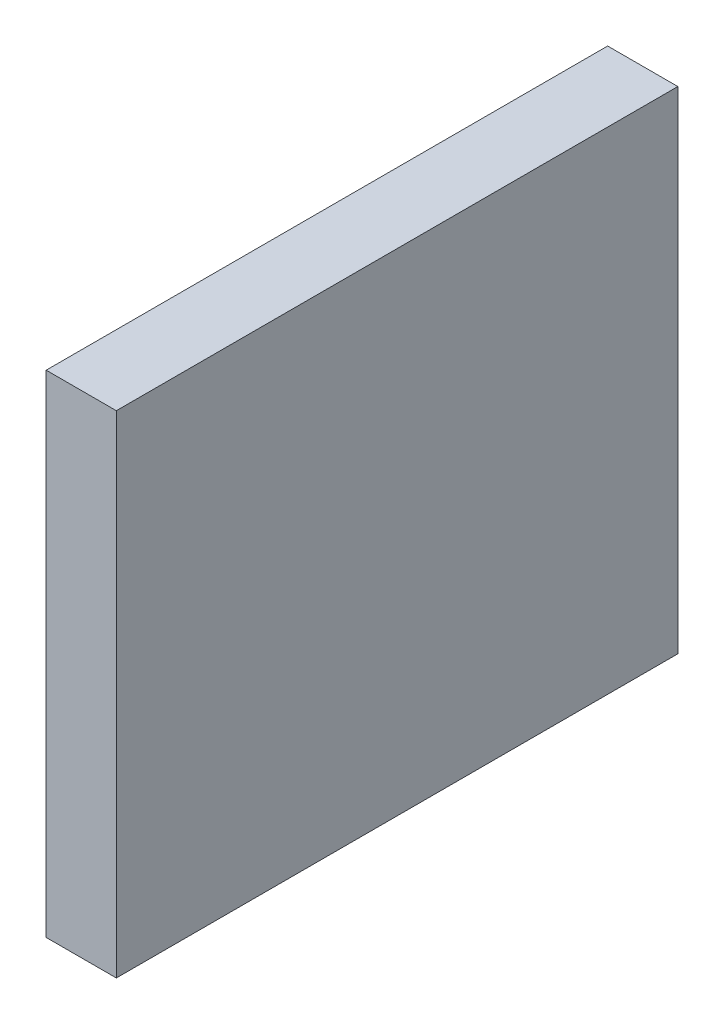
ISO-10303-21;
HEADER;
FILE_DESCRIPTION(('STEP AP214'),'2;1');
FILE_NAME('part.step','',(''),(''),'','','');
FILE_SCHEMA(('AUTOMOTIVE_DESIGN { 1 0 10303 214 1 1 1 1 }'));
ENDSEC;
DATA;
#1=APPLICATION_CONTEXT('core data for automotive mechanical design processes');
#2=APPLICATION_PROTOCOL_DEFINITION('international standard','automotive_design',2000,#1);
#3=PRODUCT_CONTEXT('',#1,'mechanical');
#4=PRODUCT('Part','Part','',(#3));
#5=PRODUCT_RELATED_PRODUCT_CATEGORY('part','',(#4));
#6=PRODUCT_DEFINITION_FORMATION('','',#4);
#7=PRODUCT_DEFINITION_CONTEXT('part definition',#1,'design');
#8=PRODUCT_DEFINITION('design','',#6,#7);
#9=PRODUCT_DEFINITION_SHAPE('','',#8);
#10=(LENGTH_UNIT() NAMED_UNIT(*) SI_UNIT(.MILLI.,.METRE.));
#11=(NAMED_UNIT(*) PLANE_ANGLE_UNIT() SI_UNIT($,.RADIAN.));
#12=(NAMED_UNIT(*) SI_UNIT($,.STERADIAN.) SOLID_ANGLE_UNIT());
#13=UNCERTAINTY_MEASURE_WITH_UNIT(LENGTH_MEASURE(1.E-05),#10,'distance_accuracy_value','');
#14=(GEOMETRIC_REPRESENTATION_CONTEXT(3) GLOBAL_UNCERTAINTY_ASSIGNED_CONTEXT((#13)) GLOBAL_UNIT_ASSIGNED_CONTEXT((#10,
#11,#12)) REPRESENTATION_CONTEXT('',''));
#15=CARTESIAN_POINT('',(0.,0.,0.));
#16=DIRECTION('',(0.,0.,1.));
#17=DIRECTION('',(1.,0.,0.));
#18=AXIS2_PLACEMENT_3D('',#15,#16,#17);
#19=CARTESIAN_POINT('',(3.175,0.,0.));
#20=DIRECTION('',(0.,0.,-1.));
#21=DIRECTION('',(-1.,0.,0.));
#22=AXIS2_PLACEMENT_3D('',#19,#20,#21);
#23=PLANE('',#22);
#24=DIRECTION('',(0.,-1.,0.));
#25=VECTOR('',#24,1.);
#26=CARTESIAN_POINT('',(0.,0.,0.));
#27=LINE('',#26,#25);
#28=CARTESIAN_POINT('',(0.,22.225,0.));
#29=VERTEX_POINT('',#28);
#30=CARTESIAN_POINT('',(0.,0.,0.));
#31=VERTEX_POINT('',#30);
#32=EDGE_CURVE('E96',#29,#31,#27,.T.);
#33=ORIENTED_EDGE('',*,*,#32,.T.);
#34=DIRECTION('',(-1.,0.,0.));
#35=VECTOR('',#34,1.);
#36=CARTESIAN_POINT('',(3.175,0.,0.));
#37=LINE('',#36,#35);
#38=CARTESIAN_POINT('',(3.175,0.,0.));
#39=VERTEX_POINT('',#38);
#40=EDGE_CURVE('E11',#39,#31,#37,.T.);
#41=ORIENTED_EDGE('',*,*,#40,.F.);
#42=DIRECTION('',(0.,-1.,0.));
#43=VECTOR('',#42,1.);
#44=CARTESIAN_POINT('',(3.175,0.,0.));
#45=LINE('',#44,#43);
#46=CARTESIAN_POINT('',(3.175,22.225,0.));
#47=VERTEX_POINT('',#46);
#48=EDGE_CURVE('E84',#47,#39,#45,.T.);
#49=ORIENTED_EDGE('',*,*,#48,.F.);
#50=DIRECTION('',(-1.,0.,0.));
#51=VECTOR('',#50,1.);
#52=CARTESIAN_POINT('',(3.175,22.225,0.));
#53=LINE('',#52,#51);
#54=EDGE_CURVE('E92',#47,#29,#53,.T.);
#55=ORIENTED_EDGE('',*,*,#54,.T.);
#56=EDGE_LOOP('',(#33,#41,#49,#55));
#57=FACE_BOUND('',#56,.T.);
#58=ADVANCED_FACE('F33',(#57),#23,.F.);
#59=CARTESIAN_POINT('',(3.175,0.,0.));
#60=DIRECTION('',(0.,1.,0.));
#61=DIRECTION('',(0.,0.,1.));
#62=AXIS2_PLACEMENT_3D('',#59,#60,#61);
#63=PLANE('',#62);
#64=DIRECTION('',(0.,0.,-1.));
#65=VECTOR('',#64,1.);
#66=CARTESIAN_POINT('',(0.,0.,0.));
#67=LINE('',#66,#65);
#68=CARTESIAN_POINT('',(0.,0.,-25.4));
#69=VERTEX_POINT('',#68);
#70=EDGE_CURVE('E88',#31,#69,#67,.T.);
#71=ORIENTED_EDGE('',*,*,#70,.T.);
#72=DIRECTION('',(-1.,0.,0.));
#73=VECTOR('',#72,1.);
#74=CARTESIAN_POINT('',(3.175,0.,-25.4));
#75=LINE('',#74,#73);
#76=CARTESIAN_POINT('',(3.175,0.,-25.4));
#77=VERTEX_POINT('',#76);
#78=EDGE_CURVE('E41',#77,#69,#75,.T.);
#79=ORIENTED_EDGE('',*,*,#78,.F.);
#80=DIRECTION('',(0.,0.,-1.));
#81=VECTOR('',#80,1.);
#82=CARTESIAN_POINT('',(3.175,0.,0.));
#83=LINE('',#82,#81);
#84=EDGE_CURVE('E79',#39,#77,#83,.T.);
#85=ORIENTED_EDGE('',*,*,#84,.F.);
#86=ORIENTED_EDGE('',*,*,#40,.T.);
#87=EDGE_LOOP('',(#71,#79,#85,#86));
#88=FACE_BOUND('',#87,.T.);
#89=ADVANCED_FACE('F87',(#88),#63,.F.);
#90=CARTESIAN_POINT('',(3.175,0.,-25.4));
#91=DIRECTION('',(0.,0.,1.));
#92=DIRECTION('',(1.,0.,0.));
#93=AXIS2_PLACEMENT_3D('',#90,#91,#92);
#94=PLANE('',#93);
#95=DIRECTION('',(0.,1.,0.));
#96=VECTOR('',#95,1.);
#97=CARTESIAN_POINT('',(0.,0.,-25.4));
#98=LINE('',#97,#96);
#99=CARTESIAN_POINT('',(0.,22.225,-25.4));
#100=VERTEX_POINT('',#99);
#101=EDGE_CURVE('E66',#69,#100,#98,.T.);
#102=ORIENTED_EDGE('',*,*,#101,.T.);
#103=DIRECTION('',(-1.,0.,0.));
#104=VECTOR('',#103,1.);
#105=CARTESIAN_POINT('',(3.175,22.225,-25.4));
#106=LINE('',#105,#104);
#107=CARTESIAN_POINT('',(3.175,22.225,-25.4));
#108=VERTEX_POINT('',#107);
#109=EDGE_CURVE('E89',#108,#100,#106,.T.);
#110=ORIENTED_EDGE('',*,*,#109,.F.);
#111=DIRECTION('',(0.,1.,0.));
#112=VECTOR('',#111,1.);
#113=CARTESIAN_POINT('',(3.175,0.,-25.4));
#114=LINE('',#113,#112);
#115=EDGE_CURVE('E82',#77,#108,#114,.T.);
#116=ORIENTED_EDGE('',*,*,#115,.F.);
#117=ORIENTED_EDGE('',*,*,#78,.T.);
#118=EDGE_LOOP('',(#102,#110,#116,#117));
#119=FACE_BOUND('',#118,.T.);
#120=ADVANCED_FACE('F90',(#119),#94,.F.);
#121=CARTESIAN_POINT('',(3.175,22.225,0.));
#122=DIRECTION('',(0.,-1.,0.));
#123=DIRECTION('',(0.,0.,-1.));
#124=AXIS2_PLACEMENT_3D('',#121,#122,#123);
#125=PLANE('',#124);
#126=DIRECTION('',(0.,0.,1.));
#127=VECTOR('',#126,1.);
#128=CARTESIAN_POINT('',(0.,22.225,0.));
#129=LINE('',#128,#127);
#130=EDGE_CURVE('E72',#100,#29,#129,.T.);
#131=ORIENTED_EDGE('',*,*,#130,.T.);
#132=ORIENTED_EDGE('',*,*,#54,.F.);
#133=DIRECTION('',(0.,0.,1.));
#134=VECTOR('',#133,1.);
#135=CARTESIAN_POINT('',(3.175,22.225,0.));
#136=LINE('',#135,#134);
#137=EDGE_CURVE('E49',#108,#47,#136,.T.);
#138=ORIENTED_EDGE('',*,*,#137,.F.);
#139=ORIENTED_EDGE('',*,*,#109,.T.);
#140=EDGE_LOOP('',(#131,#132,#138,#139));
#141=FACE_BOUND('',#140,.T.);
#142=ADVANCED_FACE('F103',(#141),#125,.F.);
#143=CARTESIAN_POINT('',(3.175,0.,0.));
#144=DIRECTION('',(-1.,0.,0.));
#145=DIRECTION('',(0.,0.,1.));
#146=AXIS2_PLACEMENT_3D('',#143,#144,#145);
#147=PLANE('',#146);
#148=ORIENTED_EDGE('',*,*,#48,.T.);
#149=ORIENTED_EDGE('',*,*,#84,.T.);
#150=ORIENTED_EDGE('',*,*,#115,.T.);
#151=ORIENTED_EDGE('',*,*,#137,.T.);
#152=EDGE_LOOP('',(#148,#149,#150,#151));
#153=FACE_BOUND('',#152,.T.);
#154=ADVANCED_FACE('F80',(#153),#147,.F.);
#155=CARTESIAN_POINT('',(0.,0.,0.));
#156=DIRECTION('',(-1.,0.,0.));
#157=DIRECTION('',(0.,0.,1.));
#158=AXIS2_PLACEMENT_3D('',#155,#156,#157);
#159=PLANE('',#158);
#160=ORIENTED_EDGE('',*,*,#32,.F.);
#161=ORIENTED_EDGE('',*,*,#130,.F.);
#162=ORIENTED_EDGE('',*,*,#101,.F.);
#163=ORIENTED_EDGE('',*,*,#70,.F.);
#164=EDGE_LOOP('',(#160,#161,#162,#163));
#165=FACE_BOUND('',#164,.T.);
#166=ADVANCED_FACE('F106',(#165),#159,.T.);
#167=CLOSED_SHELL('',(#58,#89,#120,#142,#154,#166));
#168=MANIFOLD_SOLID_BREP('B2',#167);
#169=ADVANCED_BREP_SHAPE_REPRESENTATION('',(#18,#168),#14);
#170=SHAPE_DEFINITION_REPRESENTATION(#9,#169);
ENDSEC;
END-ISO-10303-21;
